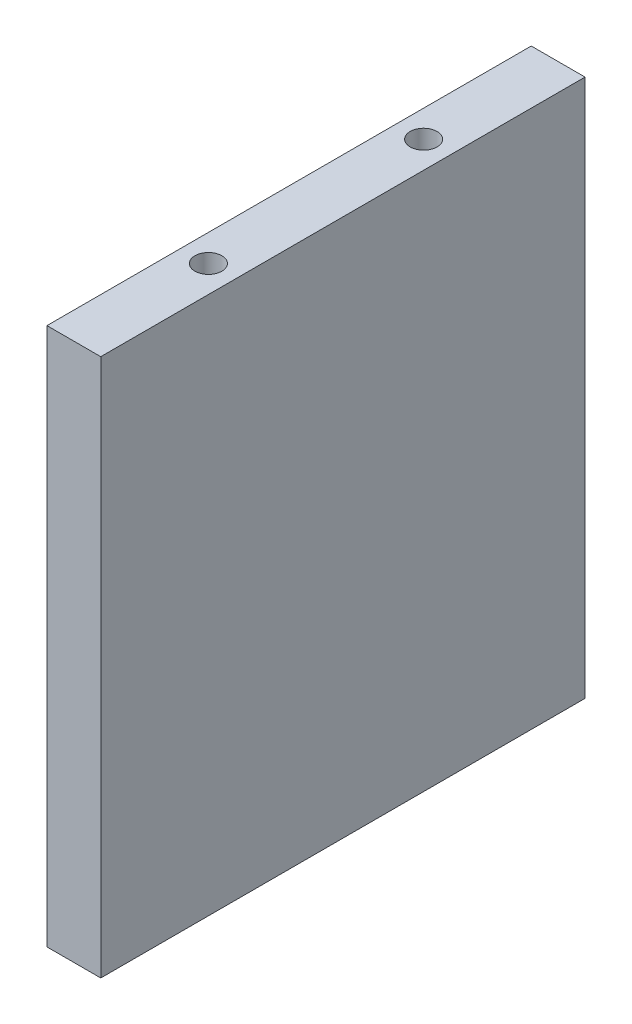
ISO-10303-21;
HEADER;
FILE_DESCRIPTION(('STEP AP214'),'2;1');
FILE_NAME('part.step','',(''),(''),'','','');
FILE_SCHEMA(('AUTOMOTIVE_DESIGN { 1 0 10303 214 1 1 1 1 }'));
ENDSEC;
DATA;
#1=APPLICATION_CONTEXT('core data for automotive mechanical design processes');
#2=APPLICATION_PROTOCOL_DEFINITION('international standard','automotive_design',2000,#1);
#3=PRODUCT_CONTEXT('',#1,'mechanical');
#4=PRODUCT('Part','Part','',(#3));
#5=PRODUCT_RELATED_PRODUCT_CATEGORY('part','',(#4));
#6=PRODUCT_DEFINITION_FORMATION('','',#4);
#7=PRODUCT_DEFINITION_CONTEXT('part definition',#1,'design');
#8=PRODUCT_DEFINITION('design','',#6,#7);
#9=PRODUCT_DEFINITION_SHAPE('','',#8);
#10=(LENGTH_UNIT() NAMED_UNIT(*) SI_UNIT(.MILLI.,.METRE.));
#11=(NAMED_UNIT(*) PLANE_ANGLE_UNIT() SI_UNIT($,.RADIAN.));
#12=(NAMED_UNIT(*) SI_UNIT($,.STERADIAN.) SOLID_ANGLE_UNIT());
#13=UNCERTAINTY_MEASURE_WITH_UNIT(LENGTH_MEASURE(1.E-05),#10,'distance_accuracy_value','');
#14=(GEOMETRIC_REPRESENTATION_CONTEXT(3) GLOBAL_UNCERTAINTY_ASSIGNED_CONTEXT((#13)) GLOBAL_UNIT_ASSIGNED_CONTEXT((#10,
#11,#12)) REPRESENTATION_CONTEXT('',''));
#15=CARTESIAN_POINT('',(0.,0.,0.));
#16=DIRECTION('',(0.,0.,1.));
#17=DIRECTION('',(1.,0.,0.));
#18=AXIS2_PLACEMENT_3D('',#15,#16,#17);
#19=CARTESIAN_POINT('',(2.5,50.,-22.5));
#20=DIRECTION('',(-1.,0.,0.));
#21=DIRECTION('',(0.,0.,1.));
#22=AXIS2_PLACEMENT_3D('',#19,#20,#21);
#23=PLANE('',#22);
#24=DIRECTION('',(0.,0.,-1.));
#25=VECTOR('',#24,1.);
#26=CARTESIAN_POINT('',(2.5,0.,-22.5));
#27=LINE('',#26,#25);
#28=CARTESIAN_POINT('',(2.5,0.,22.5));
#29=VERTEX_POINT('',#28);
#30=CARTESIAN_POINT('',(2.5,0.,-22.5));
#31=VERTEX_POINT('',#30);
#32=EDGE_CURVE('E92',#29,#31,#27,.T.);
#33=ORIENTED_EDGE('',*,*,#32,.T.);
#34=DIRECTION('',(0.,-1.,0.));
#35=VECTOR('',#34,1.);
#36=CARTESIAN_POINT('',(2.5,50.,-22.5));
#37=LINE('',#36,#35);
#38=CARTESIAN_POINT('',(2.5,50.,-22.5));
#39=VERTEX_POINT('',#38);
#40=EDGE_CURVE('E11',#39,#31,#37,.T.);
#41=ORIENTED_EDGE('',*,*,#40,.F.);
#42=DIRECTION('',(0.,0.,-1.));
#43=VECTOR('',#42,1.);
#44=CARTESIAN_POINT('',(2.5,50.,-22.5));
#45=LINE('',#44,#43);
#46=CARTESIAN_POINT('',(2.5,50.,22.5));
#47=VERTEX_POINT('',#46);
#48=EDGE_CURVE('E93',#47,#39,#45,.T.);
#49=ORIENTED_EDGE('',*,*,#48,.F.);
#50=DIRECTION('',(0.,-1.,0.));
#51=VECTOR('',#50,1.);
#52=CARTESIAN_POINT('',(2.5,50.,22.5));
#53=LINE('',#52,#51);
#54=EDGE_CURVE('E99',#47,#29,#53,.T.);
#55=ORIENTED_EDGE('',*,*,#54,.T.);
#56=EDGE_LOOP('',(#33,#41,#49,#55));
#57=FACE_BOUND('',#56,.T.);
#58=ADVANCED_FACE('F17',(#57),#23,.F.);
#59=CARTESIAN_POINT('',(-2.5,50.,-22.5));
#60=DIRECTION('',(0.,0.,1.));
#61=DIRECTION('',(1.,0.,0.));
#62=AXIS2_PLACEMENT_3D('',#59,#60,#61);
#63=PLANE('',#62);
#64=DIRECTION('',(-1.,0.,0.));
#65=VECTOR('',#64,1.);
#66=CARTESIAN_POINT('',(-2.5,0.,-22.5));
#67=LINE('',#66,#65);
#68=CARTESIAN_POINT('',(-2.5,0.,-22.5));
#69=VERTEX_POINT('',#68);
#70=EDGE_CURVE('E102',#31,#69,#67,.T.);
#71=ORIENTED_EDGE('',*,*,#70,.T.);
#72=DIRECTION('',(0.,-1.,0.));
#73=VECTOR('',#72,1.);
#74=CARTESIAN_POINT('',(-2.5,50.,-22.5));
#75=LINE('',#74,#73);
#76=CARTESIAN_POINT('',(-2.5,50.,-22.5));
#77=VERTEX_POINT('',#76);
#78=EDGE_CURVE('E25',#77,#69,#75,.T.);
#79=ORIENTED_EDGE('',*,*,#78,.F.);
#80=DIRECTION('',(-1.,0.,0.));
#81=VECTOR('',#80,1.);
#82=CARTESIAN_POINT('',(-2.5,50.,-22.5));
#83=LINE('',#82,#81);
#84=EDGE_CURVE('E64',#39,#77,#83,.T.);
#85=ORIENTED_EDGE('',*,*,#84,.F.);
#86=ORIENTED_EDGE('',*,*,#40,.T.);
#87=EDGE_LOOP('',(#71,#79,#85,#86));
#88=FACE_BOUND('',#87,.T.);
#89=ADVANCED_FACE('F128',(#88),#63,.F.);
#90=CARTESIAN_POINT('',(-2.5,50.,-22.5));
#91=DIRECTION('',(1.,0.,0.));
#92=DIRECTION('',(0.,0.,-1.));
#93=AXIS2_PLACEMENT_3D('',#90,#91,#92);
#94=PLANE('',#93);
#95=DIRECTION('',(0.,0.,1.));
#96=VECTOR('',#95,1.);
#97=CARTESIAN_POINT('',(-2.5,0.,-22.5));
#98=LINE('',#97,#96);
#99=CARTESIAN_POINT('',(-2.5,0.,22.5));
#100=VERTEX_POINT('',#99);
#101=EDGE_CURVE('E51',#69,#100,#98,.T.);
#102=ORIENTED_EDGE('',*,*,#101,.T.);
#103=DIRECTION('',(0.,-1.,0.));
#104=VECTOR('',#103,1.);
#105=CARTESIAN_POINT('',(-2.5,50.,22.5));
#106=LINE('',#105,#104);
#107=CARTESIAN_POINT('',(-2.5,50.,22.5));
#108=VERTEX_POINT('',#107);
#109=EDGE_CURVE('E107',#108,#100,#106,.T.);
#110=ORIENTED_EDGE('',*,*,#109,.F.);
#111=DIRECTION('',(0.,0.,1.));
#112=VECTOR('',#111,1.);
#113=CARTESIAN_POINT('',(-2.5,50.,-22.5));
#114=LINE('',#113,#112);
#115=EDGE_CURVE('E96',#77,#108,#114,.T.);
#116=ORIENTED_EDGE('',*,*,#115,.F.);
#117=ORIENTED_EDGE('',*,*,#78,.T.);
#118=EDGE_LOOP('',(#102,#110,#116,#117));
#119=FACE_BOUND('',#118,.T.);
#120=ADVANCED_FACE('F109',(#119),#94,.F.);
#121=CARTESIAN_POINT('',(-2.5,50.,22.5));
#122=DIRECTION('',(0.,0.,-1.));
#123=DIRECTION('',(-1.,0.,0.));
#124=AXIS2_PLACEMENT_3D('',#121,#122,#123);
#125=PLANE('',#124);
#126=DIRECTION('',(1.,0.,0.));
#127=VECTOR('',#126,1.);
#128=CARTESIAN_POINT('',(-2.5,0.,22.5));
#129=LINE('',#128,#127);
#130=EDGE_CURVE('E57',#100,#29,#129,.T.);
#131=ORIENTED_EDGE('',*,*,#130,.T.);
#132=ORIENTED_EDGE('',*,*,#54,.F.);
#133=DIRECTION('',(1.,0.,0.));
#134=VECTOR('',#133,1.);
#135=CARTESIAN_POINT('',(-2.5,50.,22.5));
#136=LINE('',#135,#134);
#137=EDGE_CURVE('E33',#108,#47,#136,.T.);
#138=ORIENTED_EDGE('',*,*,#137,.F.);
#139=ORIENTED_EDGE('',*,*,#109,.T.);
#140=EDGE_LOOP('',(#131,#132,#138,#139));
#141=FACE_BOUND('',#140,.T.);
#142=ADVANCED_FACE('F116',(#141),#125,.F.);
#143=CARTESIAN_POINT('',(0.,50.,0.));
#144=DIRECTION('',(0.,1.,0.));
#145=DIRECTION('',(0.,0.,1.));
#146=AXIS2_PLACEMENT_3D('',#143,#144,#145);
#147=PLANE('',#146);
#148=CARTESIAN_POINT('',(0.,50.,-10.));
#149=DIRECTION('',(0.,1.,0.));
#150=DIRECTION('',(0.,0.,1.));
#151=AXIS2_PLACEMENT_3D('',#148,#149,#150);
#152=CIRCLE('',#151,1.25);
#153=CARTESIAN_POINT('',(0.,50.,-8.75));
#154=VERTEX_POINT('',#153);
#155=EDGE_CURVE('E82',#154,#154,#152,.T.);
#156=ORIENTED_EDGE('',*,*,#155,.F.);
#157=EDGE_LOOP('',(#156));
#158=FACE_BOUND('',#157,.T.);
#159=CARTESIAN_POINT('',(0.,50.,10.));
#160=DIRECTION('',(0.,1.,0.));
#161=DIRECTION('',(0.,0.,1.));
#162=AXIS2_PLACEMENT_3D('',#159,#160,#161);
#163=CIRCLE('',#162,1.25);
#164=CARTESIAN_POINT('',(0.,50.,11.25));
#165=VERTEX_POINT('',#164);
#166=EDGE_CURVE('E81',#165,#165,#163,.T.);
#167=ORIENTED_EDGE('',*,*,#166,.F.);
#168=EDGE_LOOP('',(#167));
#169=FACE_BOUND('',#168,.T.);
#170=ORIENTED_EDGE('',*,*,#48,.T.);
#171=ORIENTED_EDGE('',*,*,#84,.T.);
#172=ORIENTED_EDGE('',*,*,#115,.T.);
#173=ORIENTED_EDGE('',*,*,#137,.T.);
#174=EDGE_LOOP('',(#170,#171,#172,#173));
#175=FACE_BOUND('',#174,.T.);
#176=ADVANCED_FACE('F118',(#158,#169,#175),#147,.T.);
#177=CARTESIAN_POINT('',(0.,0.,0.));
#178=DIRECTION('',(0.,1.,0.));
#179=DIRECTION('',(0.,0.,1.));
#180=AXIS2_PLACEMENT_3D('',#177,#178,#179);
#181=PLANE('',#180);
#182=ORIENTED_EDGE('',*,*,#32,.F.);
#183=ORIENTED_EDGE('',*,*,#130,.F.);
#184=ORIENTED_EDGE('',*,*,#101,.F.);
#185=ORIENTED_EDGE('',*,*,#70,.F.);
#186=EDGE_LOOP('',(#182,#183,#184,#185));
#187=FACE_BOUND('',#186,.T.);
#188=ADVANCED_FACE('F112',(#187),#181,.F.);
#189=CARTESIAN_POINT('',(0.,41.,10.));
#190=DIRECTION('',(0.,1.,0.));
#191=DIRECTION('',(0.,0.,1.));
#192=AXIS2_PLACEMENT_3D('',#189,#190,#191);
#193=CONICAL_SURFACE('',#192,1.25,1.02974425867665);
#194=CARTESIAN_POINT('',(0.,40.2489242262155,10.));
#195=VERTEX_POINT('',#194);
#196=VERTEX_LOOP('',#195);
#197=FACE_BOUND('',#196,.T.);
#198=CARTESIAN_POINT('',(0.,41.,10.));
#199=DIRECTION('',(0.,1.,0.));
#200=DIRECTION('',(0.,0.,1.));
#201=AXIS2_PLACEMENT_3D('',#198,#199,#200);
#202=CIRCLE('',#201,1.25);
#203=CARTESIAN_POINT('',(0.,41.,11.25));
#204=VERTEX_POINT('',#203);
#205=EDGE_CURVE('E85',#204,#204,#202,.T.);
#206=ORIENTED_EDGE('',*,*,#205,.T.);
#207=EDGE_LOOP('',(#206));
#208=FACE_BOUND('',#207,.T.);
#209=ADVANCED_FACE('F192',(#197,#208),#193,.F.);
#210=CARTESIAN_POINT('',(0.,50.,10.));
#211=DIRECTION('',(0.,1.,0.));
#212=DIRECTION('',(0.,0.,1.));
#213=AXIS2_PLACEMENT_3D('',#210,#211,#212);
#214=CYLINDRICAL_SURFACE('',#213,1.25);
#215=ORIENTED_EDGE('',*,*,#205,.F.);
#216=EDGE_LOOP('',(#215));
#217=FACE_BOUND('',#216,.T.);
#218=ORIENTED_EDGE('',*,*,#166,.T.);
#219=EDGE_LOOP('',(#218));
#220=FACE_BOUND('',#219,.T.);
#221=ADVANCED_FACE('F75',(#217,#220),#214,.F.);
#222=CARTESIAN_POINT('',(0.,41.,-10.));
#223=DIRECTION('',(0.,1.,0.));
#224=DIRECTION('',(0.,0.,1.));
#225=AXIS2_PLACEMENT_3D('',#222,#223,#224);
#226=CONICAL_SURFACE('',#225,1.25,1.02974425867665);
#227=CARTESIAN_POINT('',(0.,40.2489242262155,-10.));
#228=VERTEX_POINT('',#227);
#229=VERTEX_LOOP('',#228);
#230=FACE_BOUND('',#229,.T.);
#231=CARTESIAN_POINT('',(0.,41.,-10.));
#232=DIRECTION('',(0.,1.,0.));
#233=DIRECTION('',(0.,0.,1.));
#234=AXIS2_PLACEMENT_3D('',#231,#232,#233);
#235=CIRCLE('',#234,1.25);
#236=CARTESIAN_POINT('',(0.,41.,-8.75));
#237=VERTEX_POINT('',#236);
#238=EDGE_CURVE('E79',#237,#237,#235,.T.);
#239=ORIENTED_EDGE('',*,*,#238,.T.);
#240=EDGE_LOOP('',(#239));
#241=FACE_BOUND('',#240,.T.);
#242=ADVANCED_FACE('F71',(#230,#241),#226,.F.);
#243=CARTESIAN_POINT('',(0.,50.,-10.));
#244=DIRECTION('',(0.,1.,0.));
#245=DIRECTION('',(0.,0.,1.));
#246=AXIS2_PLACEMENT_3D('',#243,#244,#245);
#247=CYLINDRICAL_SURFACE('',#246,1.25);
#248=ORIENTED_EDGE('',*,*,#238,.F.);
#249=EDGE_LOOP('',(#248));
#250=FACE_BOUND('',#249,.T.);
#251=ORIENTED_EDGE('',*,*,#155,.T.);
#252=EDGE_LOOP('',(#251));
#253=FACE_BOUND('',#252,.T.);
#254=ADVANCED_FACE('F74',(#250,#253),#247,.F.);
#255=CLOSED_SHELL('',(#58,#89,#120,#142,#176,#188,#209,#221,#242,#254));
#256=MANIFOLD_SOLID_BREP('B1',#255);
#257=ADVANCED_BREP_SHAPE_REPRESENTATION('',(#18,#256),#14);
#258=SHAPE_DEFINITION_REPRESENTATION(#9,#257);
ENDSEC;
END-ISO-10303-21;
